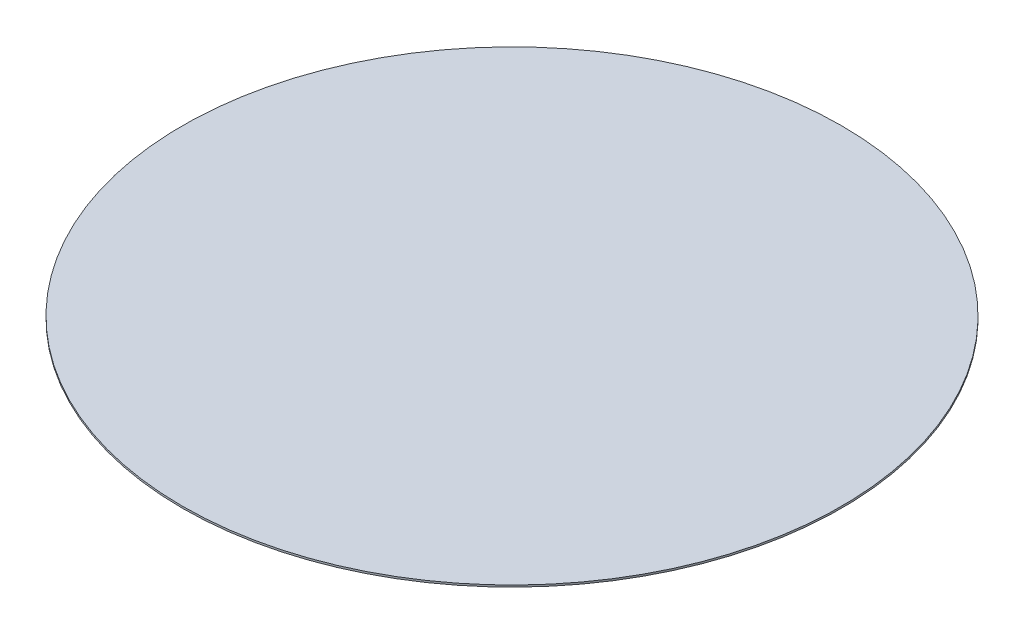
ISO-10303-21;
HEADER;
FILE_DESCRIPTION(('STEP AP214'),'2;1');
FILE_NAME('part.step','',(''),(''),'','','');
FILE_SCHEMA(('AUTOMOTIVE_DESIGN { 1 0 10303 214 1 1 1 1 }'));
ENDSEC;
DATA;
#1=APPLICATION_CONTEXT('core data for automotive mechanical design processes');
#2=APPLICATION_PROTOCOL_DEFINITION('international standard','automotive_design',2000,#1);
#3=PRODUCT_CONTEXT('',#1,'mechanical');
#4=PRODUCT('Part','Part','',(#3));
#5=PRODUCT_RELATED_PRODUCT_CATEGORY('part','',(#4));
#6=PRODUCT_DEFINITION_FORMATION('','',#4);
#7=PRODUCT_DEFINITION_CONTEXT('part definition',#1,'design');
#8=PRODUCT_DEFINITION('design','',#6,#7);
#9=PRODUCT_DEFINITION_SHAPE('','',#8);
#10=(LENGTH_UNIT() NAMED_UNIT(*) SI_UNIT(.MILLI.,.METRE.));
#11=(NAMED_UNIT(*) PLANE_ANGLE_UNIT() SI_UNIT($,.RADIAN.));
#12=(NAMED_UNIT(*) SI_UNIT($,.STERADIAN.) SOLID_ANGLE_UNIT());
#13=UNCERTAINTY_MEASURE_WITH_UNIT(LENGTH_MEASURE(1.E-05),#10,'distance_accuracy_value','');
#14=(GEOMETRIC_REPRESENTATION_CONTEXT(3) GLOBAL_UNCERTAINTY_ASSIGNED_CONTEXT((#13)) GLOBAL_UNIT_ASSIGNED_CONTEXT((#10,
#11,#12)) REPRESENTATION_CONTEXT('',''));
#15=CARTESIAN_POINT('',(0.,0.,0.));
#16=DIRECTION('',(0.,0.,1.));
#17=DIRECTION('',(1.,0.,0.));
#18=AXIS2_PLACEMENT_3D('',#15,#16,#17);
#19=CARTESIAN_POINT('',(0.,0.,0.));
#20=DIRECTION('',(0.,1.,0.));
#21=DIRECTION('',(0.,0.,1.));
#22=AXIS2_PLACEMENT_3D('',#19,#20,#21);
#23=PLANE('',#22);
#24=CARTESIAN_POINT('',(0.,0.,0.));
#25=DIRECTION('',(0.,-1.,0.));
#26=DIRECTION('',(0.,0.,-1.));
#27=AXIS2_PLACEMENT_3D('',#24,#25,#26);
#28=CIRCLE('',#27,36.);
#29=CARTESIAN_POINT('',(0.,0.,-36.));
#30=VERTEX_POINT('',#29);
#31=EDGE_CURVE('E17',#30,#30,#28,.F.);
#32=ORIENTED_EDGE('',*,*,#31,.F.);
#33=EDGE_LOOP('',(#32));
#34=FACE_BOUND('',#33,.T.);
#35=ADVANCED_FACE('F14',(#34),#23,.F.);
#36=CARTESIAN_POINT('',(0.,0.2,0.));
#37=DIRECTION('',(0.,-1.,0.));
#38=DIRECTION('',(0.,0.,-1.));
#39=AXIS2_PLACEMENT_3D('',#36,#37,#38);
#40=CYLINDRICAL_SURFACE('',#39,36.);
#41=ORIENTED_EDGE('',*,*,#31,.T.);
#42=EDGE_LOOP('',(#41));
#43=FACE_BOUND('',#42,.T.);
#44=CARTESIAN_POINT('',(0.,0.2,0.));
#45=DIRECTION('',(0.,-1.,0.));
#46=DIRECTION('',(0.,0.,-1.));
#47=AXIS2_PLACEMENT_3D('',#44,#45,#46);
#48=CIRCLE('',#47,36.);
#49=CARTESIAN_POINT('',(0.,0.2,-36.));
#50=VERTEX_POINT('',#49);
#51=EDGE_CURVE('E10',#50,#50,#48,.F.);
#52=ORIENTED_EDGE('',*,*,#51,.F.);
#53=EDGE_LOOP('',(#52));
#54=FACE_BOUND('',#53,.T.);
#55=ADVANCED_FACE('F26',(#43,#54),#40,.T.);
#56=CARTESIAN_POINT('',(0.,0.2,0.));
#57=DIRECTION('',(0.,1.,0.));
#58=DIRECTION('',(0.,0.,1.));
#59=AXIS2_PLACEMENT_3D('',#56,#57,#58);
#60=PLANE('',#59);
#61=ORIENTED_EDGE('',*,*,#51,.T.);
#62=EDGE_LOOP('',(#61));
#63=FACE_BOUND('',#62,.T.);
#64=ADVANCED_FACE('F34',(#63),#60,.T.);
#65=CLOSED_SHELL('',(#35,#55,#64));
#66=MANIFOLD_SOLID_BREP('B1',#65);
#67=ADVANCED_BREP_SHAPE_REPRESENTATION('',(#18,#66),#14);
#68=SHAPE_DEFINITION_REPRESENTATION(#9,#67);
ENDSEC;
END-ISO-10303-21;
